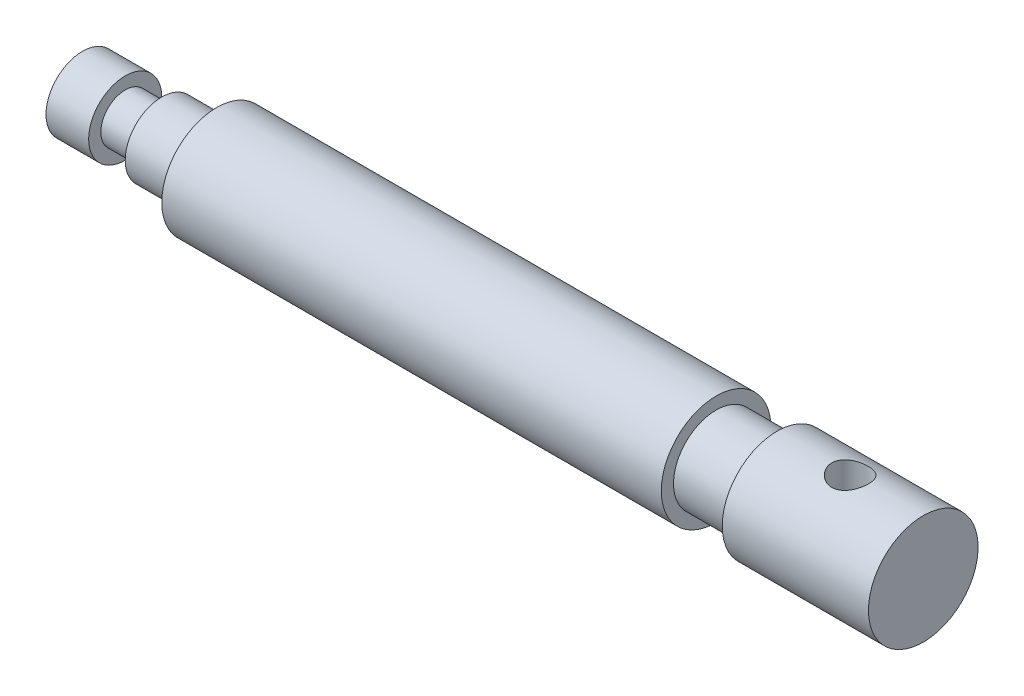
ISO-10303-21;
HEADER;
FILE_DESCRIPTION(('STEP AP214'),'2;1');
FILE_NAME('part.step','',(''),(''),'','','');
FILE_SCHEMA(('AUTOMOTIVE_DESIGN { 1 0 10303 214 1 1 1 1 }'));
ENDSEC;
DATA;
#1=APPLICATION_CONTEXT('core data for automotive mechanical design processes');
#2=APPLICATION_PROTOCOL_DEFINITION('international standard','automotive_design',2000,#1);
#3=PRODUCT_CONTEXT('',#1,'mechanical');
#4=PRODUCT('Part','Part','',(#3));
#5=PRODUCT_RELATED_PRODUCT_CATEGORY('part','',(#4));
#6=PRODUCT_DEFINITION_FORMATION('','',#4);
#7=PRODUCT_DEFINITION_CONTEXT('part definition',#1,'design');
#8=PRODUCT_DEFINITION('design','',#6,#7);
#9=PRODUCT_DEFINITION_SHAPE('','',#8);
#10=(LENGTH_UNIT() NAMED_UNIT(*) SI_UNIT(.MILLI.,.METRE.));
#11=(NAMED_UNIT(*) PLANE_ANGLE_UNIT() SI_UNIT($,.RADIAN.));
#12=(NAMED_UNIT(*) SI_UNIT($,.STERADIAN.) SOLID_ANGLE_UNIT());
#13=UNCERTAINTY_MEASURE_WITH_UNIT(LENGTH_MEASURE(1.E-05),#10,'distance_accuracy_value','');
#14=(GEOMETRIC_REPRESENTATION_CONTEXT(3) GLOBAL_UNCERTAINTY_ASSIGNED_CONTEXT((#13)) GLOBAL_UNIT_ASSIGNED_CONTEXT((#10,
#11,#12)) REPRESENTATION_CONTEXT('',''));
#15=CARTESIAN_POINT('',(0.,0.,0.));
#16=DIRECTION('',(0.,0.,1.));
#17=DIRECTION('',(1.,0.,0.));
#18=AXIS2_PLACEMENT_3D('',#15,#16,#17);
#19=CARTESIAN_POINT('',(0.,0.,0.));
#20=DIRECTION('',(-1.,0.,0.));
#21=DIRECTION('',(0.,0.,1.));
#22=AXIS2_PLACEMENT_3D('',#19,#20,#21);
#23=CYLINDRICAL_SURFACE('',#22,9.);
#24=CARTESIAN_POINT('',(114.,0.,0.));
#25=DIRECTION('',(-1.,0.,0.));
#26=DIRECTION('',(0.,0.,1.));
#27=AXIS2_PLACEMENT_3D('',#24,#25,#26);
#28=CIRCLE('',#27,9.);
#29=CARTESIAN_POINT('',(114.,0.,9.));
#30=VERTEX_POINT('',#29);
#31=EDGE_CURVE('E86',#30,#30,#28,.T.);
#32=ORIENTED_EDGE('',*,*,#31,.F.);
#33=EDGE_LOOP('',(#32));
#34=FACE_BOUND('',#33,.T.);
#35=CARTESIAN_POINT('',(138.,0.,0.));
#36=DIRECTION('',(-1.,0.,0.));
#37=DIRECTION('',(0.,0.,1.));
#38=AXIS2_PLACEMENT_3D('',#35,#36,#37);
#39=CIRCLE('',#38,9.);
#40=CARTESIAN_POINT('',(138.,0.,9.));
#41=VERTEX_POINT('',#40);
#42=EDGE_CURVE('E89',#41,#41,#39,.T.);
#43=ORIENTED_EDGE('',*,*,#42,.T.);
#44=EDGE_LOOP('',(#43));
#45=FACE_BOUND('',#44,.T.);
#46=CARTESIAN_POINT('',(126.,-8.48528137423857,-2.99999999999999));
#47=CARTESIAN_POINT('',(126.163404524508,-8.48528083591302,-3.00000077384313));
#48=CARTESIAN_POINT('',(126.326804399471,-8.49005307872572,-2.98660435105656));
#49=CARTESIAN_POINT('',(126.648763262983,-8.50852722243764,-2.93355339506642));
#50=CARTESIAN_POINT('',(126.807321449617,-8.52223059426566,-2.89389453650519));
#51=CARTESIAN_POINT('',(127.114880678992,-8.55684611066375,-2.78986645705471));
#52=CARTESIAN_POINT('',(127.263899788328,-8.57774411913965,-2.72554566420974));
#53=CARTESIAN_POINT('',(127.549080145644,-8.62437366030974,-2.57418488532414));
#54=CARTESIAN_POINT('',(127.685238547661,-8.65010625910837,-2.48713988658054));
#55=CARTESIAN_POINT('',(127.946159887015,-8.70463468222419,-2.28915343932863));
#56=CARTESIAN_POINT('',(128.070346286015,-8.73350684533932,-2.17747302413376));
#57=CARTESIAN_POINT('',(128.298620403674,-8.79041594403009,-1.93496300164319));
#58=CARTESIAN_POINT('',(128.402704894747,-8.81845274486884,-1.80413032515713));
#59=CARTESIAN_POINT('',(128.590436691989,-8.87141600765397,-1.52281352389503));
#60=CARTESIAN_POINT('',(128.673479911854,-8.89624223104816,-1.37190573367358));
#61=CARTESIAN_POINT('',(128.812774755383,-8.93908760312948,-1.05729366896243));
#62=CARTESIAN_POINT('',(128.869033599531,-8.95710858609006,-0.893592857061646));
#63=CARTESIAN_POINT('',(128.951207563897,-8.9837722629572,-0.564086452300493));
#64=CARTESIAN_POINT('',(128.978110338771,-8.99271944332677,-0.398552264558917));
#65=CARTESIAN_POINT('',(129.003948880082,-9.00130824654743,-0.0650936244722813));
#66=CARTESIAN_POINT('',(129.002891854957,-9.00095226788686,0.102830200631677));
#67=CARTESIAN_POINT('',(128.973467236302,-8.99118118856194,0.429310545581432));
#68=CARTESIAN_POINT('',(128.946172414577,-8.98212194265352,0.587976145774957));
#69=CARTESIAN_POINT('',(128.866821057059,-8.95640902019195,0.898330316466502));
#70=CARTESIAN_POINT('',(128.814762843061,-8.93975482893545,1.05001841333763));
#71=CARTESIAN_POINT('',(128.686736048082,-8.90027010879673,1.3444574245259));
#72=CARTESIAN_POINT('',(128.61046218436,-8.87736127572047,1.48706466290652));
#73=CARTESIAN_POINT('',(128.436420883654,-8.82775179116758,1.75777297658195));
#74=CARTESIAN_POINT('',(128.338647470017,-8.80105008604401,1.88587000315601));
#75=CARTESIAN_POINT('',(128.118976819621,-8.7451857554969,2.13030259965391));
#76=CARTESIAN_POINT('',(127.996160526476,-8.71596645506633,2.24580047119581));
#77=CARTESIAN_POINT('',(127.73265382282,-8.65942005746702,2.45483177879451));
#78=CARTESIAN_POINT('',(127.591960662816,-8.63209325236846,2.54836182984462));
#79=CARTESIAN_POINT('',(127.29403912319,-8.58211575363337,2.71196236510722));
#80=CARTESIAN_POINT('',(127.136603606047,-8.55953727854244,2.78167939086401));
#81=CARTESIAN_POINT('',(126.811285817357,-8.52244952473154,2.893329579808));
#82=CARTESIAN_POINT('',(126.643407956381,-8.50793686461278,2.93527438724247));
#83=CARTESIAN_POINT('',(126.310084933765,-8.48938908946755,2.98848384629256));
#84=CARTESIAN_POINT('',(126.144871725754,-8.48491080956268,3.00104728652289));
#85=CARTESIAN_POINT('',(125.814671552658,-8.48570016177553,2.99881631672915));
#86=CARTESIAN_POINT('',(125.649684551928,-8.49096602375443,2.98402687568028));
#87=CARTESIAN_POINT('',(125.330529102864,-8.51020854270898,2.92867695465693));
#88=CARTESIAN_POINT('',(125.176183709548,-8.52387976322521,2.88901918194205));
#89=CARTESIAN_POINT('',(124.876369181282,-8.55805661013069,2.7861415876814));
#90=CARTESIAN_POINT('',(124.730901625228,-8.57856344804518,2.72291758909027));
#91=CARTESIAN_POINT('',(124.447858737459,-8.6249063278736,2.57242302221681));
#92=CARTESIAN_POINT('',(124.310680072075,-8.65089076996885,2.48445335507549));
#93=CARTESIAN_POINT('',(124.052561842849,-8.70497306192896,2.28775689167267));
#94=CARTESIAN_POINT('',(123.931627084016,-8.73307153331383,2.17902397649635));
#95=CARTESIAN_POINT('',(123.703416047728,-8.78985115913547,1.93767511770098));
#96=CARTESIAN_POINT('',(123.597076829943,-8.81849530733689,1.80416181163996));
#97=CARTESIAN_POINT('',(123.408251572956,-8.87180554839326,1.52048187420077));
#98=CARTESIAN_POINT('',(123.325764686513,-8.89647178253084,1.37031583459366));
#99=CARTESIAN_POINT('',(123.187739685415,-8.93893217431809,1.0583395872969));
#100=CARTESIAN_POINT('',(123.132026168556,-8.95677090013593,0.896613369963601));
#101=CARTESIAN_POINT('',(123.04881677382,-8.98375832513323,0.565375397538062));
#102=CARTESIAN_POINT('',(123.021310710359,-8.99291016102056,0.395866475861682));
#103=CARTESIAN_POINT('',(122.996213767183,-9.00125589708769,0.0624460075801376));
#104=CARTESIAN_POINT('',(122.997277638203,-9.00089760268317,-0.10135417176004));
#105=CARTESIAN_POINT('',(123.025971924439,-8.99136589558194,-0.426333435000506));
#106=CARTESIAN_POINT('',(123.053600184458,-8.98219319800727,-0.587512730457154));
#107=CARTESIAN_POINT('',(123.133746703728,-8.95622744863237,-0.900126358296159));
#108=CARTESIAN_POINT('',(123.185862646059,-8.93955775083446,-1.05167481273835));
#109=CARTESIAN_POINT('',(123.313132593291,-8.90031482113485,-1.34393505281937));
#110=CARTESIAN_POINT('',(123.388290765591,-8.87774052144049,-1.48464487242728));
#111=CARTESIAN_POINT('',(123.562708536306,-8.82797606483643,-1.75690204892634));
#112=CARTESIAN_POINT('',(123.662756056145,-8.8006461747578,-1.8879187546728));
#113=CARTESIAN_POINT('',(123.882772173469,-8.74478966375639,-2.13174307881726));
#114=CARTESIAN_POINT('',(124.002747126788,-8.71626266319292,-2.24454486487376));
#115=CARTESIAN_POINT('',(124.264828066761,-8.65989839476795,-2.45322542649934));
#116=CARTESIAN_POINT('',(124.40761653293,-8.63213183965892,-2.54826889799369));
#117=CARTESIAN_POINT('',(124.708003280708,-8.58180579969046,-2.71294302990333));
#118=CARTESIAN_POINT('',(124.865597679089,-8.55924495483748,-2.78258033045841));
#119=CARTESIAN_POINT('',(125.183885472047,-8.52304002619544,-2.89153148461249));
#120=CARTESIAN_POINT('',(125.344116790576,-8.50903898571547,-2.93207372744855));
#121=CARTESIAN_POINT('',(125.6695681514,-8.49016150618555,-2.9863029604478));
#122=CARTESIAN_POINT('',(125.834786452232,-8.48528191852383,-2.99999921758977));
#123=CARTESIAN_POINT('',(126.,-8.48528137423857,-2.99999999999999));
#124=B_SPLINE_CURVE_WITH_KNOTS('',3,(#46,#47,#48,#49,#50,#51,#52,#53,#54,#55,#56,#57,#58,#59,
#60,#61,#62,#63,#64,#65,#66,#67,#68,#69,#70,#71,#72,#73,#74,#75,#76,#77,#78,#79,#80,#81,#82,#83,
#84,#85,#86,#87,#88,#89,#90,#91,#92,#93,#94,#95,#96,#97,#98,#99,#100,#101,#102,#103,#104,#105,
#106,#107,#108,#109,#110,#111,#112,#113,#114,#115,#116,#117,#118,#119,#120,#121,#122,#123),
.UNSPECIFIED.,.T.,.F.,(4,2,2,2,2,2,2,2,2,2,2,2,2,2,2,2,2,2,2,2,2,2,2,2,2,2,2,2,2,2,2,2,2,2,2,2,
2,2,4),(0.,0.489601754398035,0.979284165045477,1.46800988250248,1.9568434985563,
2.46304012282703,2.96931795515962,3.48880518430969,4.00815229160364,4.509429562948,
5.0105775990698,5.49207014476704,5.97359532567707,6.46144964581002,6.94943975622062,
7.46040523091749,7.97144938836314,8.48977919529162,9.00789154069845,9.50262874093315,
9.99727607511698,10.4749318730632,10.9526723744083,11.4455657320714,11.9386045698638,
12.4553642451327,12.9721055627259,13.4854137357255,13.9985364901246,14.487542540329,
14.9765089202934,15.4577086812128,15.9389955228972,16.438065585619,16.9372951329789,
17.4560670820843,17.9747033480059,18.4698963648807,18.9649184157139),.UNSPECIFIED.);
#125=CARTESIAN_POINT('',(126.,-8.48528137423857,-2.99999999999999));
#126=VERTEX_POINT('',#125);
#127=EDGE_CURVE('E45',#126,#126,#124,.T.);
#128=ORIENTED_EDGE('',*,*,#127,.F.);
#129=EDGE_LOOP('',(#128));
#130=FACE_BOUND('',#129,.T.);
#131=CARTESIAN_POINT('',(123.,9.,0.));
#132=CARTESIAN_POINT('',(122.999999238805,9.00000045902832,0.16369008866017));
#133=CARTESIAN_POINT('',(123.013440798382,8.99549308522634,0.32737558361565));
#134=CARTESIAN_POINT('',(123.066687326452,8.97795630609842,0.649925282618916));
#135=CARTESIAN_POINT('',(123.106495031847,8.96492601606458,0.808788984356451));
#136=CARTESIAN_POINT('',(123.210957730152,8.93175923719328,1.11699836850533));
#137=CARTESIAN_POINT('',(123.275571187378,8.9116346319256,1.2663594776581));
#138=CARTESIAN_POINT('',(123.427623518515,8.86633337152025,1.55212481041597));
#139=CARTESIAN_POINT('',(123.515066895008,8.84115572003334,1.68852647087611));
#140=CARTESIAN_POINT('',(123.713477414576,8.78742283329015,1.94922502506679));
#141=CARTESIAN_POINT('',(123.825093702781,8.75878669391354,2.07301110089492));
#142=CARTESIAN_POINT('',(124.06730146412,8.70180944349364,2.30049807810625));
#143=CARTESIAN_POINT('',(124.197897104786,8.67346839871647,2.40419455646838));
#144=CARTESIAN_POINT('',(124.478955345589,8.61939997431821,2.59147482668357));
#145=CARTESIAN_POINT('',(124.629881219196,8.59377117827065,2.67439457466309));
#146=CARTESIAN_POINT('',(124.944528283376,8.54925916255804,2.81345662163316));
#147=CARTESIAN_POINT('',(125.108245551488,8.53037388482237,2.86960709216028));
#148=CARTESIAN_POINT('',(125.43801966449,8.50233909808132,2.95162038452748));
#149=CARTESIAN_POINT('',(125.603811625467,8.49288287308834,2.9784403448153));
#150=CARTESIAN_POINT('',(125.937791262468,8.48386969888523,3.00402337000343));
#151=CARTESIAN_POINT('',(126.105978182128,8.4843096906819,3.00279510481415));
#152=CARTESIAN_POINT('',(126.431809891332,8.49477045024541,2.97305971111025));
#153=CARTESIAN_POINT('',(126.589585208757,8.50435247602599,2.94580173950098));
#154=CARTESIAN_POINT('',(126.898180258821,8.53129973173653,2.86681848854825));
#155=CARTESIAN_POINT('',(127.048999156305,8.54866589352323,2.81509027977561));
#156=CARTESIAN_POINT('',(127.342238248774,8.58953733393746,2.68781717418063));
#157=CARTESIAN_POINT('',(127.484484076409,8.61313697379352,2.61190214612178));
#158=CARTESIAN_POINT('',(127.754612724839,8.66377675727179,2.43866731890942));
#159=CARTESIAN_POINT('',(127.8824913808,8.6908178937139,2.34134133709202));
#160=CARTESIAN_POINT('',(128.127274794482,8.74701987503222,2.12204799804672));
#161=CARTESIAN_POINT('',(128.243258083527,8.77621768064528,1.99905945022894));
#162=CARTESIAN_POINT('',(128.45319379999,8.8322081516111,1.73501870991019));
#163=CARTESIAN_POINT('',(128.547144114493,8.85900058614202,1.59396478698243));
#164=CARTESIAN_POINT('',(128.711088900705,8.90751323813381,1.29584283913878));
#165=CARTESIAN_POINT('',(128.780836474022,8.92918050024118,1.13862982924899));
#166=CARTESIAN_POINT('',(128.892609521867,8.96461701433305,0.813807250093503));
#167=CARTESIAN_POINT('',(128.93464462627,8.97838900964638,0.646201314464846));
#168=CARTESIAN_POINT('',(128.988166998067,8.99602881214321,0.313151488587903));
#169=CARTESIAN_POINT('',(129.000899427518,9.00030005501184,0.14792879959453));
#170=CARTESIAN_POINT('',(128.999001979205,8.99966708084482,-0.182325209880719));
#171=CARTESIAN_POINT('',(128.98437672006,8.99476441258087,-0.347356557958956));
#172=CARTESIAN_POINT('',(128.929164276792,8.97660074151313,-0.667559598912768));
#173=CARTESIAN_POINT('',(128.889341381852,8.96358596133577,-0.822878420504529));
#174=CARTESIAN_POINT('',(128.7858196666,8.9307554049021,-1.12456787573872));
#175=CARTESIAN_POINT('',(128.722117801597,8.91093876140025,-1.27093736552582));
#176=CARTESIAN_POINT('',(128.570788704478,8.86586793861869,-1.55486488917982));
#177=CARTESIAN_POINT('',(128.48257622015,8.84048444267358,-1.69208987765144));
#178=CARTESIAN_POINT('',(128.28541754996,8.78715761748787,-1.95019449040675));
#179=CARTESIAN_POINT('',(128.176465031905,8.75921350781483,-2.07106910338673));
#180=CARTESIAN_POINT('',(127.93506374698,8.70230543941334,-2.2987575234189));
#181=CARTESIAN_POINT('',(127.801772319219,8.67335283262284,-2.40468290773731));
#182=CARTESIAN_POINT('',(127.518685296567,8.61899919884126,-2.59277256697071));
#183=CARTESIAN_POINT('',(127.368889564098,8.59359820146007,-2.67493664379303));
#184=CARTESIAN_POINT('',(127.05698095413,8.54947175374151,-2.81279079124908));
#185=CARTESIAN_POINT('',(126.894893762494,8.53073282378937,-2.86853439649506));
#186=CARTESIAN_POINT('',(126.562864049868,8.50232496919349,-2.95168400027806));
#187=CARTESIAN_POINT('',(126.392925103787,8.49265195870918,-2.97910276486181));
#188=CARTESIAN_POINT('',(126.059408711877,8.48393576622532,-3.00382884743202));
#189=CARTESIAN_POINT('',(125.89595297914,8.48437200772246,-3.00261077192519));
#190=CARTESIAN_POINT('',(125.571704775234,8.49453809471602,-2.97372688034607));
#191=CARTESIAN_POINT('',(125.410912146135,8.50426738708085,-2.94606263837575));
#192=CARTESIAN_POINT('',(125.099593010993,8.53153572914675,-2.86611543938802));
#193=CARTESIAN_POINT('',(124.948929524986,8.54892294067433,-2.81431003804653));
#194=CARTESIAN_POINT('',(124.658317779185,8.58949196455406,-2.68793809727923));
#195=CARTESIAN_POINT('',(124.518371906436,8.6126750629018,-2.61336650566141));
#196=CARTESIAN_POINT('',(124.246548990231,8.66348487678139,-2.43978207775028));
#197=CARTESIAN_POINT('',(124.115290494305,8.69126134926411,-2.33984472829374));
#198=CARTESIAN_POINT('',(123.870930559847,8.74750068849758,-2.11992864940694));
#199=CARTESIAN_POINT('',(123.757834272936,8.77596374737117,-1.99994425335444));
#200=CARTESIAN_POINT('',(123.548566763132,8.83170091576633,-1.73772467076205));
#201=CARTESIAN_POINT('',(123.453226956747,8.8588854540377,-1.59480454049917));
#202=CARTESIAN_POINT('',(123.288028713448,8.90777973517836,-1.29407207221987));
#203=CARTESIAN_POINT('',(123.218163762234,8.92949087723789,-1.13626355439704));
#204=CARTESIAN_POINT('',(123.108835102534,8.96416545205625,-0.817480941602925));
#205=CARTESIAN_POINT('',(123.06815260121,8.97747637267568,-0.656963273029225));
#206=CARTESIAN_POINT('',(123.013739157969,8.99539221192665,-0.330961248030742));
#207=CARTESIAN_POINT('',(123.00000076951,8.99999953595715,-0.165478276706239));
#208=CARTESIAN_POINT('',(123.,9.,0.));
#209=B_SPLINE_CURVE_WITH_KNOTS('',3,(#131,#132,#133,#134,#135,#136,#137,#138,#139,#140,#141,
#142,#143,#144,#145,#146,#147,#148,#149,#150,#151,#152,#153,#154,#155,#156,#157,#158,#159,#160,
#161,#162,#163,#164,#165,#166,#167,#168,#169,#170,#171,#172,#173,#174,#175,#176,#177,#178,#179,
#180,#181,#182,#183,#184,#185,#186,#187,#188,#189,#190,#191,#192,#193,#194,#195,#196,#197,#198,
#199,#200,#201,#202,#203,#204,#205,#206,#207,#208),.UNSPECIFIED.,.T.,.F.,(4,2,2,2,2,2,2,2,2,2,2,
2,2,2,2,2,2,2,2,2,2,2,2,2,2,2,2,2,2,2,2,2,2,2,2,2,2,2,4),(0.,0.490461318078033,0.98097355580256,
1.47066801861082,1.96045913339729,2.46554052848267,2.9707329986259,3.4904515447041,
4.01001134078498,4.51205777225522,5.01394901962457,5.49290479653841,5.97191792566444,
6.4586451346539,6.94551307674618,7.45779917434098,7.97013437899854,8.48755216951072,
9.00479006631623,9.49960749525507,9.99434139492528,10.4747447393464,10.9552093585231,
11.4483119953121,11.9415654246567,12.4572306864225,12.9729002470499,13.4875204148031,
14.0019085411752,14.4898699819277,14.9778023805412,15.4564676124125,15.9352391452793,
16.4349020007541,16.9347063337133,17.453989825053,17.9731404345737,18.4690967512144,
18.9649159811442),.UNSPECIFIED.);
#210=CARTESIAN_POINT('',(123.,9.,0.));
#211=VERTEX_POINT('',#210);
#212=EDGE_CURVE('E10',#211,#211,#209,.T.);
#213=ORIENTED_EDGE('',*,*,#212,.F.);
#214=EDGE_LOOP('',(#213));
#215=FACE_BOUND('',#214,.T.);
#216=ADVANCED_FACE('F33',(#34,#45,#130,#215),#23,.T.);
#217=CARTESIAN_POINT('',(0.,0.,0.));
#218=DIRECTION('',(1.,0.,0.));
#219=DIRECTION('',(0.,0.,-1.));
#220=AXIS2_PLACEMENT_3D('',#217,#218,#219);
#221=PLANE('',#220);
#222=CARTESIAN_POINT('',(0.,0.,0.));
#223=DIRECTION('',(-1.,0.,0.));
#224=DIRECTION('',(0.,0.,1.));
#225=AXIS2_PLACEMENT_3D('',#222,#223,#224);
#226=CIRCLE('',#225,6.);
#227=CARTESIAN_POINT('',(0.,0.,6.));
#228=VERTEX_POINT('',#227);
#229=EDGE_CURVE('E49',#228,#228,#226,.T.);
#230=ORIENTED_EDGE('',*,*,#229,.T.);
#231=EDGE_LOOP('',(#230));
#232=FACE_BOUND('',#231,.T.);
#233=ADVANCED_FACE('F35',(#232),#221,.F.);
#234=CARTESIAN_POINT('',(0.,0.,0.));
#235=DIRECTION('',(-1.,0.,0.));
#236=DIRECTION('',(0.,0.,1.));
#237=AXIS2_PLACEMENT_3D('',#234,#235,#236);
#238=CYLINDRICAL_SURFACE('',#237,6.);
#239=ORIENTED_EDGE('',*,*,#229,.F.);
#240=EDGE_LOOP('',(#239));
#241=FACE_BOUND('',#240,.T.);
#242=CARTESIAN_POINT('',(7.,0.,0.));
#243=DIRECTION('',(-1.,0.,0.));
#244=DIRECTION('',(0.,0.,1.));
#245=AXIS2_PLACEMENT_3D('',#242,#243,#244);
#246=CIRCLE('',#245,6.);
#247=CARTESIAN_POINT('',(7.,0.,6.));
#248=VERTEX_POINT('',#247);
#249=EDGE_CURVE('E53',#248,#248,#246,.T.);
#250=ORIENTED_EDGE('',*,*,#249,.T.);
#251=EDGE_LOOP('',(#250));
#252=FACE_BOUND('',#251,.T.);
#253=ADVANCED_FACE('F81',(#241,#252),#238,.T.);
#254=CARTESIAN_POINT('',(7.,0.,-6.));
#255=DIRECTION('',(-1.,0.,0.));
#256=DIRECTION('',(0.,0.,1.));
#257=AXIS2_PLACEMENT_3D('',#254,#255,#256);
#258=PLANE('',#257);
#259=ORIENTED_EDGE('',*,*,#249,.F.);
#260=EDGE_LOOP('',(#259));
#261=FACE_BOUND('',#260,.T.);
#262=CARTESIAN_POINT('',(7.,0.,0.));
#263=DIRECTION('',(-1.,0.,0.));
#264=DIRECTION('',(0.,0.,1.));
#265=AXIS2_PLACEMENT_3D('',#262,#263,#264);
#266=CIRCLE('',#265,4.);
#267=CARTESIAN_POINT('',(7.,0.,4.));
#268=VERTEX_POINT('',#267);
#269=EDGE_CURVE('E115',#268,#268,#266,.T.);
#270=ORIENTED_EDGE('',*,*,#269,.T.);
#271=EDGE_LOOP('',(#270));
#272=FACE_BOUND('',#271,.T.);
#273=ADVANCED_FACE('F121',(#261,#272),#258,.F.);
#274=CARTESIAN_POINT('',(0.,0.,0.));
#275=DIRECTION('',(-1.,0.,0.));
#276=DIRECTION('',(0.,0.,1.));
#277=AXIS2_PLACEMENT_3D('',#274,#275,#276);
#278=CYLINDRICAL_SURFACE('',#277,4.);
#279=ORIENTED_EDGE('',*,*,#269,.F.);
#280=EDGE_LOOP('',(#279));
#281=FACE_BOUND('',#280,.T.);
#282=CARTESIAN_POINT('',(13.,0.,0.));
#283=DIRECTION('',(-1.,0.,0.));
#284=DIRECTION('',(0.,0.,1.));
#285=AXIS2_PLACEMENT_3D('',#282,#283,#284);
#286=CIRCLE('',#285,4.);
#287=CARTESIAN_POINT('',(13.,0.,4.));
#288=VERTEX_POINT('',#287);
#289=EDGE_CURVE('E112',#288,#288,#286,.T.);
#290=ORIENTED_EDGE('',*,*,#289,.T.);
#291=EDGE_LOOP('',(#290));
#292=FACE_BOUND('',#291,.T.);
#293=ADVANCED_FACE('F124',(#281,#292),#278,.T.);
#294=CARTESIAN_POINT('',(13.,0.,-4.));
#295=DIRECTION('',(1.,0.,0.));
#296=DIRECTION('',(0.,0.,-1.));
#297=AXIS2_PLACEMENT_3D('',#294,#295,#296);
#298=PLANE('',#297);
#299=ORIENTED_EDGE('',*,*,#289,.F.);
#300=EDGE_LOOP('',(#299));
#301=FACE_BOUND('',#300,.T.);
#302=CARTESIAN_POINT('',(13.,0.,0.));
#303=DIRECTION('',(-1.,0.,0.));
#304=DIRECTION('',(0.,0.,1.));
#305=AXIS2_PLACEMENT_3D('',#302,#303,#304);
#306=CIRCLE('',#305,6.);
#307=CARTESIAN_POINT('',(13.,0.,6.));
#308=VERTEX_POINT('',#307);
#309=EDGE_CURVE('E109',#308,#308,#306,.T.);
#310=ORIENTED_EDGE('',*,*,#309,.T.);
#311=EDGE_LOOP('',(#310));
#312=FACE_BOUND('',#311,.T.);
#313=ADVANCED_FACE('F130',(#301,#312),#298,.F.);
#314=CARTESIAN_POINT('',(0.,0.,0.));
#315=DIRECTION('',(-1.,0.,0.));
#316=DIRECTION('',(0.,0.,1.));
#317=AXIS2_PLACEMENT_3D('',#314,#315,#316);
#318=CYLINDRICAL_SURFACE('',#317,6.);
#319=ORIENTED_EDGE('',*,*,#309,.F.);
#320=EDGE_LOOP('',(#319));
#321=FACE_BOUND('',#320,.T.);
#322=CARTESIAN_POINT('',(22.,0.,0.));
#323=DIRECTION('',(-1.,0.,0.));
#324=DIRECTION('',(0.,0.,1.));
#325=AXIS2_PLACEMENT_3D('',#322,#323,#324);
#326=CIRCLE('',#325,6.);
#327=CARTESIAN_POINT('',(22.,0.,6.));
#328=VERTEX_POINT('',#327);
#329=EDGE_CURVE('E106',#328,#328,#326,.T.);
#330=ORIENTED_EDGE('',*,*,#329,.T.);
#331=EDGE_LOOP('',(#330));
#332=FACE_BOUND('',#331,.T.);
#333=ADVANCED_FACE('F136',(#321,#332),#318,.T.);
#334=CARTESIAN_POINT('',(22.,0.,-6.));
#335=DIRECTION('',(1.,0.,0.));
#336=DIRECTION('',(0.,0.,-1.));
#337=AXIS2_PLACEMENT_3D('',#334,#335,#336);
#338=PLANE('',#337);
#339=ORIENTED_EDGE('',*,*,#329,.F.);
#340=EDGE_LOOP('',(#339));
#341=FACE_BOUND('',#340,.T.);
#342=CARTESIAN_POINT('',(22.,0.,0.));
#343=DIRECTION('',(-1.,0.,0.));
#344=DIRECTION('',(0.,0.,1.));
#345=AXIS2_PLACEMENT_3D('',#342,#343,#344);
#346=CIRCLE('',#345,9.);
#347=CARTESIAN_POINT('',(22.,0.,9.));
#348=VERTEX_POINT('',#347);
#349=EDGE_CURVE('E103',#348,#348,#346,.T.);
#350=ORIENTED_EDGE('',*,*,#349,.T.);
#351=EDGE_LOOP('',(#350));
#352=FACE_BOUND('',#351,.T.);
#353=ADVANCED_FACE('F142',(#341,#352),#338,.F.);
#354=CARTESIAN_POINT('',(0.,0.,0.));
#355=DIRECTION('',(-1.,0.,0.));
#356=DIRECTION('',(0.,0.,1.));
#357=AXIS2_PLACEMENT_3D('',#354,#355,#356);
#358=CYLINDRICAL_SURFACE('',#357,9.);
#359=ORIENTED_EDGE('',*,*,#349,.F.);
#360=EDGE_LOOP('',(#359));
#361=FACE_BOUND('',#360,.T.);
#362=CARTESIAN_POINT('',(104.,0.,0.));
#363=DIRECTION('',(-1.,0.,0.));
#364=DIRECTION('',(0.,0.,1.));
#365=AXIS2_PLACEMENT_3D('',#362,#363,#364);
#366=CIRCLE('',#365,9.);
#367=CARTESIAN_POINT('',(104.,0.,9.));
#368=VERTEX_POINT('',#367);
#369=EDGE_CURVE('E100',#368,#368,#366,.T.);
#370=ORIENTED_EDGE('',*,*,#369,.T.);
#371=EDGE_LOOP('',(#370));
#372=FACE_BOUND('',#371,.T.);
#373=ADVANCED_FACE('F148',(#361,#372),#358,.T.);
#374=CARTESIAN_POINT('',(104.,0.,-7.));
#375=DIRECTION('',(-1.,0.,0.));
#376=DIRECTION('',(0.,0.,1.));
#377=AXIS2_PLACEMENT_3D('',#374,#375,#376);
#378=PLANE('',#377);
#379=ORIENTED_EDGE('',*,*,#369,.F.);
#380=EDGE_LOOP('',(#379));
#381=FACE_BOUND('',#380,.T.);
#382=CARTESIAN_POINT('',(104.,0.,0.));
#383=DIRECTION('',(-1.,0.,0.));
#384=DIRECTION('',(0.,0.,1.));
#385=AXIS2_PLACEMENT_3D('',#382,#383,#384);
#386=CIRCLE('',#385,7.);
#387=CARTESIAN_POINT('',(104.,0.,7.));
#388=VERTEX_POINT('',#387);
#389=EDGE_CURVE('E97',#388,#388,#386,.T.);
#390=ORIENTED_EDGE('',*,*,#389,.T.);
#391=EDGE_LOOP('',(#390));
#392=FACE_BOUND('',#391,.T.);
#393=ADVANCED_FACE('F154',(#381,#392),#378,.F.);
#394=CARTESIAN_POINT('',(0.,0.,0.));
#395=DIRECTION('',(-1.,0.,0.));
#396=DIRECTION('',(0.,0.,1.));
#397=AXIS2_PLACEMENT_3D('',#394,#395,#396);
#398=CYLINDRICAL_SURFACE('',#397,7.);
#399=ORIENTED_EDGE('',*,*,#389,.F.);
#400=EDGE_LOOP('',(#399));
#401=FACE_BOUND('',#400,.T.);
#402=CARTESIAN_POINT('',(114.,0.,0.));
#403=DIRECTION('',(-1.,0.,0.));
#404=DIRECTION('',(0.,0.,1.));
#405=AXIS2_PLACEMENT_3D('',#402,#403,#404);
#406=CIRCLE('',#405,7.);
#407=CARTESIAN_POINT('',(114.,0.,7.));
#408=VERTEX_POINT('',#407);
#409=EDGE_CURVE('E92',#408,#408,#406,.T.);
#410=ORIENTED_EDGE('',*,*,#409,.T.);
#411=EDGE_LOOP('',(#410));
#412=FACE_BOUND('',#411,.T.);
#413=ADVANCED_FACE('F73',(#401,#412),#398,.T.);
#414=CARTESIAN_POINT('',(114.,0.,-9.));
#415=DIRECTION('',(1.,0.,0.));
#416=DIRECTION('',(0.,0.,-1.));
#417=AXIS2_PLACEMENT_3D('',#414,#415,#416);
#418=PLANE('',#417);
#419=ORIENTED_EDGE('',*,*,#409,.F.);
#420=EDGE_LOOP('',(#419));
#421=FACE_BOUND('',#420,.T.);
#422=ORIENTED_EDGE('',*,*,#31,.T.);
#423=EDGE_LOOP('',(#422));
#424=FACE_BOUND('',#423,.T.);
#425=ADVANCED_FACE('F68',(#421,#424),#418,.F.);
#426=CARTESIAN_POINT('',(138.,0.,-9.));
#427=DIRECTION('',(-1.,0.,0.));
#428=DIRECTION('',(0.,0.,1.));
#429=AXIS2_PLACEMENT_3D('',#426,#427,#428);
#430=PLANE('',#429);
#431=ORIENTED_EDGE('',*,*,#42,.F.);
#432=EDGE_LOOP('',(#431));
#433=FACE_BOUND('',#432,.T.);
#434=ADVANCED_FACE('F65',(#433),#430,.F.);
#435=CARTESIAN_POINT('',(126.,9.,0.));
#436=DIRECTION('',(0.,-1.,0.));
#437=DIRECTION('',(0.,0.,-1.));
#438=AXIS2_PLACEMENT_3D('',#435,#436,#437);
#439=CYLINDRICAL_SURFACE('',#438,2.99999999999999);
#440=ORIENTED_EDGE('',*,*,#127,.T.);
#441=EDGE_LOOP('',(#440));
#442=FACE_BOUND('',#441,.T.);
#443=ORIENTED_EDGE('',*,*,#212,.T.);
#444=EDGE_LOOP('',(#443));
#445=FACE_BOUND('',#444,.T.);
#446=ADVANCED_FACE('F62',(#442,#445),#439,.F.);
#447=CLOSED_SHELL('',(#216,#233,#253,#273,#293,#313,#333,#353,#373,#393,#413,#425,#434,#446));
#448=MANIFOLD_SOLID_BREP('B2',#447);
#449=ADVANCED_BREP_SHAPE_REPRESENTATION('',(#18,#448),#14);
#450=SHAPE_DEFINITION_REPRESENTATION(#9,#449);
ENDSEC;
END-ISO-10303-21;
